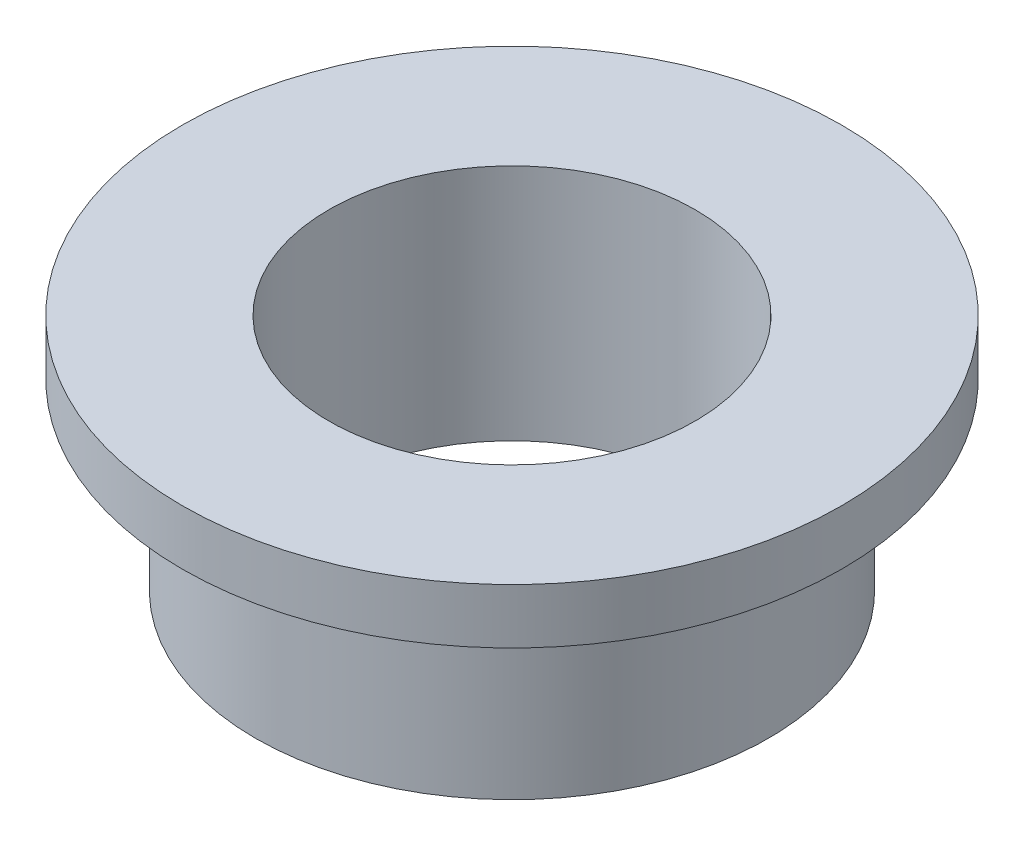
ISO-10303-21;
HEADER;
FILE_DESCRIPTION(('STEP AP214'),'2;1');
FILE_NAME('part.step','',(''),(''),'','','');
FILE_SCHEMA(('AUTOMOTIVE_DESIGN { 1 0 10303 214 1 1 1 1 }'));
ENDSEC;
DATA;
#1=APPLICATION_CONTEXT('core data for automotive mechanical design processes');
#2=APPLICATION_PROTOCOL_DEFINITION('international standard','automotive_design',2000,#1);
#3=PRODUCT_CONTEXT('',#1,'mechanical');
#4=PRODUCT('Part','Part','',(#3));
#5=PRODUCT_RELATED_PRODUCT_CATEGORY('part','',(#4));
#6=PRODUCT_DEFINITION_FORMATION('','',#4);
#7=PRODUCT_DEFINITION_CONTEXT('part definition',#1,'design');
#8=PRODUCT_DEFINITION('design','',#6,#7);
#9=PRODUCT_DEFINITION_SHAPE('','',#8);
#10=(LENGTH_UNIT() NAMED_UNIT(*) SI_UNIT(.MILLI.,.METRE.));
#11=(NAMED_UNIT(*) PLANE_ANGLE_UNIT() SI_UNIT($,.RADIAN.));
#12=(NAMED_UNIT(*) SI_UNIT($,.STERADIAN.) SOLID_ANGLE_UNIT());
#13=UNCERTAINTY_MEASURE_WITH_UNIT(LENGTH_MEASURE(1.E-05),#10,'distance_accuracy_value','');
#14=(GEOMETRIC_REPRESENTATION_CONTEXT(3) GLOBAL_UNCERTAINTY_ASSIGNED_CONTEXT((#13)) GLOBAL_UNIT_ASSIGNED_CONTEXT((#10,
#11,#12)) REPRESENTATION_CONTEXT('',''));
#15=CARTESIAN_POINT('',(0.,0.,0.));
#16=DIRECTION('',(0.,0.,1.));
#17=DIRECTION('',(1.,0.,0.));
#18=AXIS2_PLACEMENT_3D('',#15,#16,#17);
#19=CARTESIAN_POINT('',(7.,0.,0.));
#20=DIRECTION('',(0.,-1.,0.));
#21=DIRECTION('',(0.,0.,-1.));
#22=AXIS2_PLACEMENT_3D('',#19,#20,#21);
#23=PLANE('',#22);
#24=CARTESIAN_POINT('',(0.,0.,0.));
#25=DIRECTION('',(0.,-1.,0.));
#26=DIRECTION('',(0.,0.,-1.));
#27=AXIS2_PLACEMENT_3D('',#24,#25,#26);
#28=CIRCLE('',#27,7.);
#29=CARTESIAN_POINT('',(0.,0.,-7.));
#30=VERTEX_POINT('',#29);
#31=EDGE_CURVE('E52',#30,#30,#28,.T.);
#32=ORIENTED_EDGE('',*,*,#31,.T.);
#33=EDGE_LOOP('',(#32));
#34=FACE_BOUND('',#33,.T.);
#35=CARTESIAN_POINT('',(0.,0.,0.));
#36=DIRECTION('',(0.,-1.,0.));
#37=DIRECTION('',(0.,0.,-1.));
#38=AXIS2_PLACEMENT_3D('',#35,#36,#37);
#39=CIRCLE('',#38,5.);
#40=CARTESIAN_POINT('',(0.,0.,-5.));
#41=VERTEX_POINT('',#40);
#42=EDGE_CURVE('E10',#41,#41,#39,.T.);
#43=ORIENTED_EDGE('',*,*,#42,.F.);
#44=EDGE_LOOP('',(#43));
#45=FACE_BOUND('',#44,.T.);
#46=ADVANCED_FACE('F30',(#34,#45),#23,.T.);
#47=CARTESIAN_POINT('',(0.,0.,0.));
#48=DIRECTION('',(0.,-1.,0.));
#49=DIRECTION('',(0.,0.,-1.));
#50=AXIS2_PLACEMENT_3D('',#47,#48,#49);
#51=CYLINDRICAL_SURFACE('',#50,5.);
#52=ORIENTED_EDGE('',*,*,#42,.T.);
#53=EDGE_LOOP('',(#52));
#54=FACE_BOUND('',#53,.T.);
#55=CARTESIAN_POINT('',(0.,6.5,0.));
#56=DIRECTION('',(0.,-1.,0.));
#57=DIRECTION('',(0.,0.,-1.));
#58=AXIS2_PLACEMENT_3D('',#55,#56,#57);
#59=CIRCLE('',#58,5.);
#60=CARTESIAN_POINT('',(0.,6.5,-5.));
#61=VERTEX_POINT('',#60);
#62=EDGE_CURVE('E36',#61,#61,#59,.T.);
#63=ORIENTED_EDGE('',*,*,#62,.F.);
#64=EDGE_LOOP('',(#63));
#65=FACE_BOUND('',#64,.T.);
#66=ADVANCED_FACE('F70',(#54,#65),#51,.F.);
#67=CARTESIAN_POINT('',(5.,6.5,0.));
#68=DIRECTION('',(0.,1.,0.));
#69=DIRECTION('',(0.,0.,1.));
#70=AXIS2_PLACEMENT_3D('',#67,#68,#69);
#71=PLANE('',#70);
#72=ORIENTED_EDGE('',*,*,#62,.T.);
#73=EDGE_LOOP('',(#72));
#74=FACE_BOUND('',#73,.T.);
#75=CARTESIAN_POINT('',(0.,6.5,0.));
#76=DIRECTION('',(0.,-1.,0.));
#77=DIRECTION('',(0.,0.,-1.));
#78=AXIS2_PLACEMENT_3D('',#75,#76,#77);
#79=CIRCLE('',#78,9.);
#80=CARTESIAN_POINT('',(0.,6.5,-9.));
#81=VERTEX_POINT('',#80);
#82=EDGE_CURVE('E40',#81,#81,#79,.T.);
#83=ORIENTED_EDGE('',*,*,#82,.F.);
#84=EDGE_LOOP('',(#83));
#85=FACE_BOUND('',#84,.T.);
#86=ADVANCED_FACE('F74',(#74,#85),#71,.T.);
#87=CARTESIAN_POINT('',(0.,0.,0.));
#88=DIRECTION('',(0.,-1.,0.));
#89=DIRECTION('',(0.,0.,-1.));
#90=AXIS2_PLACEMENT_3D('',#87,#88,#89);
#91=CYLINDRICAL_SURFACE('',#90,9.);
#92=ORIENTED_EDGE('',*,*,#82,.T.);
#93=EDGE_LOOP('',(#92));
#94=FACE_BOUND('',#93,.T.);
#95=CARTESIAN_POINT('',(0.,5.,0.));
#96=DIRECTION('',(0.,-1.,0.));
#97=DIRECTION('',(0.,0.,-1.));
#98=AXIS2_PLACEMENT_3D('',#95,#96,#97);
#99=CIRCLE('',#98,9.);
#100=CARTESIAN_POINT('',(0.,5.,-9.));
#101=VERTEX_POINT('',#100);
#102=EDGE_CURVE('E44',#101,#101,#99,.T.);
#103=ORIENTED_EDGE('',*,*,#102,.F.);
#104=EDGE_LOOP('',(#103));
#105=FACE_BOUND('',#104,.T.);
#106=ADVANCED_FACE('F66',(#94,#105),#91,.T.);
#107=CARTESIAN_POINT('',(9.,5.,0.));
#108=DIRECTION('',(0.,-1.,0.));
#109=DIRECTION('',(0.,0.,-1.));
#110=AXIS2_PLACEMENT_3D('',#107,#108,#109);
#111=PLANE('',#110);
#112=ORIENTED_EDGE('',*,*,#102,.T.);
#113=EDGE_LOOP('',(#112));
#114=FACE_BOUND('',#113,.T.);
#115=CARTESIAN_POINT('',(0.,5.,0.));
#116=DIRECTION('',(0.,-1.,0.));
#117=DIRECTION('',(0.,0.,-1.));
#118=AXIS2_PLACEMENT_3D('',#115,#116,#117);
#119=CIRCLE('',#118,7.);
#120=CARTESIAN_POINT('',(0.,5.,-7.));
#121=VERTEX_POINT('',#120);
#122=EDGE_CURVE('E49',#121,#121,#119,.T.);
#123=ORIENTED_EDGE('',*,*,#122,.F.);
#124=EDGE_LOOP('',(#123));
#125=FACE_BOUND('',#124,.T.);
#126=ADVANCED_FACE('F60',(#114,#125),#111,.T.);
#127=CARTESIAN_POINT('',(0.,0.,0.));
#128=DIRECTION('',(0.,-1.,0.));
#129=DIRECTION('',(0.,0.,-1.));
#130=AXIS2_PLACEMENT_3D('',#127,#128,#129);
#131=CYLINDRICAL_SURFACE('',#130,7.);
#132=ORIENTED_EDGE('',*,*,#122,.T.);
#133=EDGE_LOOP('',(#132));
#134=FACE_BOUND('',#133,.T.);
#135=ORIENTED_EDGE('',*,*,#31,.F.);
#136=EDGE_LOOP('',(#135));
#137=FACE_BOUND('',#136,.T.);
#138=ADVANCED_FACE('F58',(#134,#137),#131,.T.);
#139=CLOSED_SHELL('',(#46,#66,#86,#106,#126,#138));
#140=MANIFOLD_SOLID_BREP('B2',#139);
#141=ADVANCED_BREP_SHAPE_REPRESENTATION('',(#18,#140),#14);
#142=SHAPE_DEFINITION_REPRESENTATION(#9,#141);
ENDSEC;
END-ISO-10303-21;
